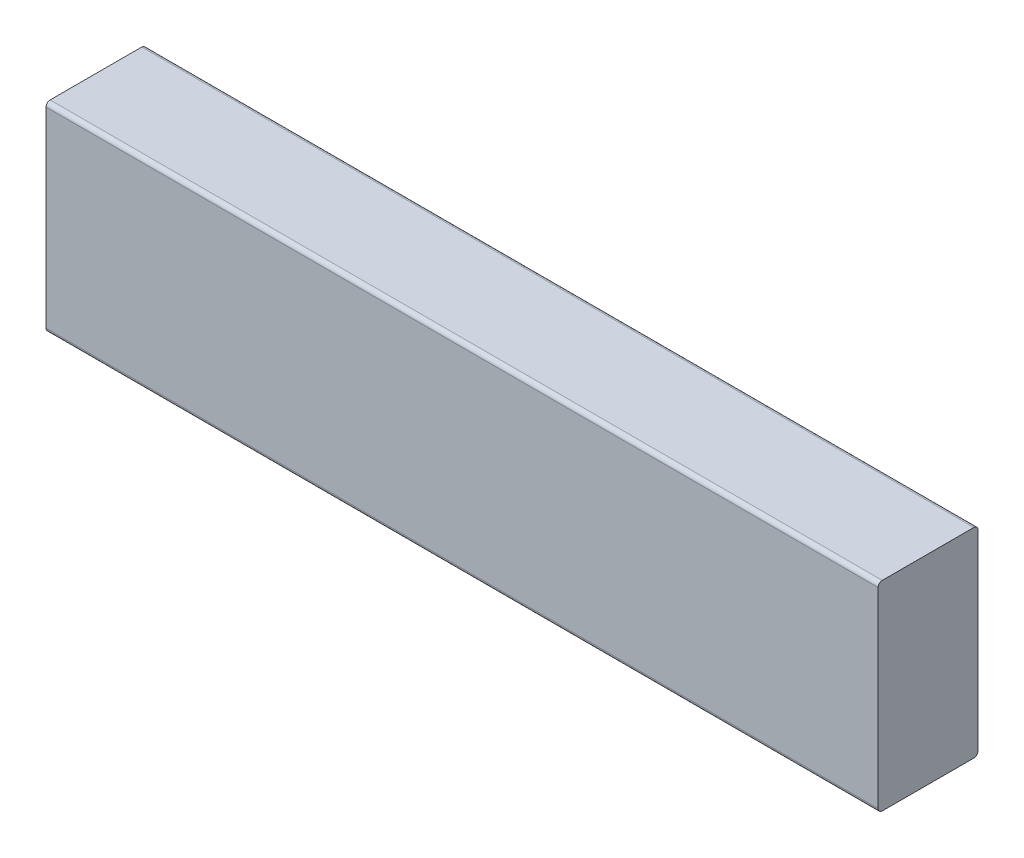
ISO-10303-21;
HEADER;
FILE_DESCRIPTION(('STEP AP214'),'2;1');
FILE_NAME('part.step','',(''),(''),'','','');
FILE_SCHEMA(('AUTOMOTIVE_DESIGN { 1 0 10303 214 1 1 1 1 }'));
ENDSEC;
DATA;
#1=APPLICATION_CONTEXT('core data for automotive mechanical design processes');
#2=APPLICATION_PROTOCOL_DEFINITION('international standard','automotive_design',2000,#1);
#3=PRODUCT_CONTEXT('',#1,'mechanical');
#4=PRODUCT('Part','Part','',(#3));
#5=PRODUCT_RELATED_PRODUCT_CATEGORY('part','',(#4));
#6=PRODUCT_DEFINITION_FORMATION('','',#4);
#7=PRODUCT_DEFINITION_CONTEXT('part definition',#1,'design');
#8=PRODUCT_DEFINITION('design','',#6,#7);
#9=PRODUCT_DEFINITION_SHAPE('','',#8);
#10=(LENGTH_UNIT() NAMED_UNIT(*) SI_UNIT(.MILLI.,.METRE.));
#11=(NAMED_UNIT(*) PLANE_ANGLE_UNIT() SI_UNIT($,.RADIAN.));
#12=(NAMED_UNIT(*) SI_UNIT($,.STERADIAN.) SOLID_ANGLE_UNIT());
#13=UNCERTAINTY_MEASURE_WITH_UNIT(LENGTH_MEASURE(1.E-05),#10,'distance_accuracy_value','');
#14=(GEOMETRIC_REPRESENTATION_CONTEXT(3) GLOBAL_UNCERTAINTY_ASSIGNED_CONTEXT((#13)) GLOBAL_UNIT_ASSIGNED_CONTEXT((#10,
#11,#12)) REPRESENTATION_CONTEXT('',''));
#15=CARTESIAN_POINT('',(0.,0.,0.));
#16=DIRECTION('',(0.,0.,1.));
#17=DIRECTION('',(1.,0.,0.));
#18=AXIS2_PLACEMENT_3D('',#15,#16,#17);
#19=CARTESIAN_POINT('',(0.,6.,6.));
#20=DIRECTION('',(0.,-1.,0.));
#21=DIRECTION('',(1.,0.,0.));
#22=AXIS2_PLACEMENT_3D('',#19,#20,#21);
#23=PLANE('',#22);
#24=DIRECTION('',(0.,0.,-1.));
#25=VECTOR('',#24,1.);
#26=CARTESIAN_POINT('',(6.,6.,6.));
#27=LINE('',#26,#25);
#28=CARTESIAN_POINT('',(6.,6.,5.75));
#29=VERTEX_POINT('',#28);
#30=CARTESIAN_POINT('',(6.,6.,0.25));
#31=VERTEX_POINT('',#30);
#32=EDGE_CURVE('E121',#29,#31,#27,.T.);
#33=ORIENTED_EDGE('',*,*,#32,.T.);
#34=DIRECTION('',(-1.,0.,0.));
#35=VECTOR('',#34,1.);
#36=CARTESIAN_POINT('',(-44.,5.99999999999999,0.25));
#37=LINE('',#36,#35);
#38=CARTESIAN_POINT('',(-44.,5.99999999999999,0.25));
#39=VERTEX_POINT('',#38);
#40=EDGE_CURVE('E11',#31,#39,#37,.T.);
#41=ORIENTED_EDGE('',*,*,#40,.T.);
#42=DIRECTION('',(0.,0.,-1.));
#43=VECTOR('',#42,1.);
#44=CARTESIAN_POINT('',(-44.,5.99999999999999,6.));
#45=LINE('',#44,#43);
#46=CARTESIAN_POINT('',(-44.,5.99999999999999,5.75));
#47=VERTEX_POINT('',#46);
#48=EDGE_CURVE('E126',#47,#39,#45,.T.);
#49=ORIENTED_EDGE('',*,*,#48,.F.);
#50=DIRECTION('',(-1.,0.,0.));
#51=VECTOR('',#50,1.);
#52=CARTESIAN_POINT('',(0.,6.,5.75));
#53=LINE('',#52,#51);
#54=EDGE_CURVE('E41',#47,#29,#53,.F.);
#55=ORIENTED_EDGE('',*,*,#54,.T.);
#56=EDGE_LOOP('',(#33,#41,#49,#55));
#57=FACE_BOUND('',#56,.T.);
#58=ADVANCED_FACE('F33',(#57),#23,.F.);
#59=CARTESIAN_POINT('',(-44.,5.99999999999999,6.));
#60=DIRECTION('',(1.,0.,0.));
#61=DIRECTION('',(0.,0.,-1.));
#62=AXIS2_PLACEMENT_3D('',#59,#60,#61);
#63=PLANE('',#62);
#64=DIRECTION('',(0.,-1.,0.));
#65=VECTOR('',#64,1.);
#66=CARTESIAN_POINT('',(-44.,5.99999999999999,0.));
#67=LINE('',#66,#65);
#68=CARTESIAN_POINT('',(-44.,5.74999999999999,0.));
#69=VERTEX_POINT('',#68);
#70=CARTESIAN_POINT('',(-44.,-5.75,0.));
#71=VERTEX_POINT('',#70);
#72=EDGE_CURVE('E120',#69,#71,#67,.T.);
#73=ORIENTED_EDGE('',*,*,#72,.T.);
#74=CARTESIAN_POINT('',(-44.,-5.75,0.25));
#75=DIRECTION('',(1.,0.,0.));
#76=DIRECTION('',(0.,0.,-1.));
#77=AXIS2_PLACEMENT_3D('',#74,#75,#76);
#78=CIRCLE('',#77,0.25);
#79=CARTESIAN_POINT('',(-44.,-6.,0.25));
#80=VERTEX_POINT('',#79);
#81=EDGE_CURVE('E144',#71,#80,#78,.F.);
#82=ORIENTED_EDGE('',*,*,#81,.T.);
#83=DIRECTION('',(0.,0.,-1.));
#84=VECTOR('',#83,1.);
#85=CARTESIAN_POINT('',(-44.,-6.,6.));
#86=LINE('',#85,#84);
#87=CARTESIAN_POINT('',(-44.,-6.,5.75));
#88=VERTEX_POINT('',#87);
#89=EDGE_CURVE('E130',#88,#80,#86,.T.);
#90=ORIENTED_EDGE('',*,*,#89,.F.);
#91=CARTESIAN_POINT('',(-44.,-5.75,5.75));
#92=DIRECTION('',(1.,0.,0.));
#93=DIRECTION('',(0.,0.,-1.));
#94=AXIS2_PLACEMENT_3D('',#91,#92,#93);
#95=CIRCLE('',#94,0.25);
#96=CARTESIAN_POINT('',(-44.,-5.75,6.));
#97=VERTEX_POINT('',#96);
#98=EDGE_CURVE('E125',#88,#97,#95,.F.);
#99=ORIENTED_EDGE('',*,*,#98,.T.);
#100=DIRECTION('',(0.,-1.,0.));
#101=VECTOR('',#100,1.);
#102=CARTESIAN_POINT('',(-44.,5.99999999999999,6.));
#103=LINE('',#102,#101);
#104=CARTESIAN_POINT('',(-44.,5.74999999999999,6.));
#105=VERTEX_POINT('',#104);
#106=EDGE_CURVE('E163',#105,#97,#103,.T.);
#107=ORIENTED_EDGE('',*,*,#106,.F.);
#108=CARTESIAN_POINT('',(-44.,5.74999999999999,5.75));
#109=DIRECTION('',(1.,0.,0.));
#110=DIRECTION('',(0.,0.,-1.));
#111=AXIS2_PLACEMENT_3D('',#108,#109,#110);
#112=CIRCLE('',#111,0.25);
#113=EDGE_CURVE('E55',#105,#47,#112,.F.);
#114=ORIENTED_EDGE('',*,*,#113,.T.);
#115=ORIENTED_EDGE('',*,*,#48,.T.);
#116=CARTESIAN_POINT('',(-44.,5.74999999999999,0.25));
#117=DIRECTION('',(1.,0.,0.));
#118=DIRECTION('',(0.,0.,-1.));
#119=AXIS2_PLACEMENT_3D('',#116,#117,#118);
#120=CIRCLE('',#119,0.25);
#121=EDGE_CURVE('E48',#39,#69,#120,.F.);
#122=ORIENTED_EDGE('',*,*,#121,.T.);
#123=EDGE_LOOP('',(#73,#82,#90,#99,#107,#114,#115,#122));
#124=FACE_BOUND('',#123,.T.);
#125=ADVANCED_FACE('F165',(#124),#63,.F.);
#126=CARTESIAN_POINT('',(-44.,-6.,6.));
#127=DIRECTION('',(0.,1.,0.));
#128=DIRECTION('',(0.,0.,1.));
#129=AXIS2_PLACEMENT_3D('',#126,#127,#128);
#130=PLANE('',#129);
#131=ORIENTED_EDGE('',*,*,#89,.T.);
#132=DIRECTION('',(1.,0.,0.));
#133=VECTOR('',#132,1.);
#134=CARTESIAN_POINT('',(6.,-6.,0.25));
#135=LINE('',#134,#133);
#136=CARTESIAN_POINT('',(6.,-6.,0.25));
#137=VERTEX_POINT('',#136);
#138=EDGE_CURVE('E119',#80,#137,#135,.T.);
#139=ORIENTED_EDGE('',*,*,#138,.T.);
#140=DIRECTION('',(0.,0.,-1.));
#141=VECTOR('',#140,1.);
#142=CARTESIAN_POINT('',(6.,-6.,6.));
#143=LINE('',#142,#141);
#144=CARTESIAN_POINT('',(6.,-6.,5.75));
#145=VERTEX_POINT('',#144);
#146=EDGE_CURVE('E102',#145,#137,#143,.T.);
#147=ORIENTED_EDGE('',*,*,#146,.F.);
#148=DIRECTION('',(1.,0.,0.));
#149=VECTOR('',#148,1.);
#150=CARTESIAN_POINT('',(-44.,-6.,5.75));
#151=LINE('',#150,#149);
#152=EDGE_CURVE('E116',#145,#88,#151,.F.);
#153=ORIENTED_EDGE('',*,*,#152,.T.);
#154=EDGE_LOOP('',(#131,#139,#147,#153));
#155=FACE_BOUND('',#154,.T.);
#156=ADVANCED_FACE('F115',(#155),#130,.F.);
#157=CARTESIAN_POINT('',(0.,0.,6.));
#158=DIRECTION('',(0.,0.,-1.));
#159=DIRECTION('',(-1.,0.,0.));
#160=AXIS2_PLACEMENT_3D('',#157,#158,#159);
#161=PLANE('',#160);
#162=ORIENTED_EDGE('',*,*,#106,.T.);
#163=DIRECTION('',(1.,0.,0.));
#164=VECTOR('',#163,1.);
#165=CARTESIAN_POINT('',(0.,-5.75,6.));
#166=LINE('',#165,#164);
#167=CARTESIAN_POINT('',(6.,-5.75,6.));
#168=VERTEX_POINT('',#167);
#169=EDGE_CURVE('E149',#97,#168,#166,.T.);
#170=ORIENTED_EDGE('',*,*,#169,.T.);
#171=DIRECTION('',(0.,1.,0.));
#172=VECTOR('',#171,1.);
#173=CARTESIAN_POINT('',(6.,6.,6.));
#174=LINE('',#173,#172);
#175=CARTESIAN_POINT('',(6.,5.75,6.));
#176=VERTEX_POINT('',#175);
#177=EDGE_CURVE('E104',#168,#176,#174,.T.);
#178=ORIENTED_EDGE('',*,*,#177,.T.);
#179=DIRECTION('',(-1.,0.,0.));
#180=VECTOR('',#179,1.);
#181=CARTESIAN_POINT('',(0.,5.75,6.));
#182=LINE('',#181,#180);
#183=EDGE_CURVE('E146',#176,#105,#182,.T.);
#184=ORIENTED_EDGE('',*,*,#183,.T.);
#185=EDGE_LOOP('',(#162,#170,#178,#184));
#186=FACE_BOUND('',#185,.T.);
#187=ADVANCED_FACE('F162',(#186),#161,.F.);
#188=CARTESIAN_POINT('',(0.,0.,0.));
#189=DIRECTION('',(0.,0.,-1.));
#190=DIRECTION('',(-1.,0.,0.));
#191=AXIS2_PLACEMENT_3D('',#188,#189,#190);
#192=PLANE('',#191);
#193=DIRECTION('',(0.,1.,0.));
#194=VECTOR('',#193,1.);
#195=CARTESIAN_POINT('',(6.,6.,0.));
#196=LINE('',#195,#194);
#197=CARTESIAN_POINT('',(6.,-5.75,0.));
#198=VERTEX_POINT('',#197);
#199=CARTESIAN_POINT('',(6.,5.75,0.));
#200=VERTEX_POINT('',#199);
#201=EDGE_CURVE('E169',#198,#200,#196,.T.);
#202=ORIENTED_EDGE('',*,*,#201,.F.);
#203=DIRECTION('',(1.,0.,0.));
#204=VECTOR('',#203,1.);
#205=CARTESIAN_POINT('',(-44.,-5.75,0.));
#206=LINE('',#205,#204);
#207=EDGE_CURVE('E139',#198,#71,#206,.F.);
#208=ORIENTED_EDGE('',*,*,#207,.T.);
#209=ORIENTED_EDGE('',*,*,#72,.F.);
#210=DIRECTION('',(-1.,0.,0.));
#211=VECTOR('',#210,1.);
#212=CARTESIAN_POINT('',(6.,5.75,0.));
#213=LINE('',#212,#211);
#214=EDGE_CURVE('E137',#69,#200,#213,.F.);
#215=ORIENTED_EDGE('',*,*,#214,.T.);
#216=EDGE_LOOP('',(#202,#208,#209,#215));
#217=FACE_BOUND('',#216,.T.);
#218=ADVANCED_FACE('F177',(#217),#192,.T.);
#219=CARTESIAN_POINT('',(6.,6.,6.));
#220=DIRECTION('',(-1.,0.,0.));
#221=DIRECTION('',(0.,0.,1.));
#222=AXIS2_PLACEMENT_3D('',#219,#220,#221);
#223=PLANE('',#222);
#224=ORIENTED_EDGE('',*,*,#146,.T.);
#225=CARTESIAN_POINT('',(6.,-5.75,0.25));
#226=DIRECTION('',(-1.,0.,0.));
#227=DIRECTION('',(0.,0.,1.));
#228=AXIS2_PLACEMENT_3D('',#225,#226,#227);
#229=CIRCLE('',#228,0.25);
#230=EDGE_CURVE('E109',#137,#198,#229,.F.);
#231=ORIENTED_EDGE('',*,*,#230,.T.);
#232=ORIENTED_EDGE('',*,*,#201,.T.);
#233=CARTESIAN_POINT('',(6.,5.75,0.25));
#234=DIRECTION('',(-1.,0.,0.));
#235=DIRECTION('',(0.,0.,1.));
#236=AXIS2_PLACEMENT_3D('',#233,#234,#235);
#237=CIRCLE('',#236,0.25);
#238=EDGE_CURVE('E110',#200,#31,#237,.F.);
#239=ORIENTED_EDGE('',*,*,#238,.T.);
#240=ORIENTED_EDGE('',*,*,#32,.F.);
#241=CARTESIAN_POINT('',(6.,5.75,5.75));
#242=DIRECTION('',(-1.,0.,0.));
#243=DIRECTION('',(0.,0.,1.));
#244=AXIS2_PLACEMENT_3D('',#241,#242,#243);
#245=CIRCLE('',#244,0.25);
#246=EDGE_CURVE('E128',#29,#176,#245,.F.);
#247=ORIENTED_EDGE('',*,*,#246,.T.);
#248=ORIENTED_EDGE('',*,*,#177,.F.);
#249=CARTESIAN_POINT('',(6.,-5.75,5.75));
#250=DIRECTION('',(-1.,0.,0.));
#251=DIRECTION('',(0.,0.,1.));
#252=AXIS2_PLACEMENT_3D('',#249,#250,#251);
#253=CIRCLE('',#252,0.25);
#254=EDGE_CURVE('E99',#168,#145,#253,.F.);
#255=ORIENTED_EDGE('',*,*,#254,.T.);
#256=EDGE_LOOP('',(#224,#231,#232,#239,#240,#247,#248,#255));
#257=FACE_BOUND('',#256,.T.);
#258=ADVANCED_FACE('F101',(#257),#223,.F.);
#259=CARTESIAN_POINT('',(-44.,-5.75,0.25));
#260=DIRECTION('',(-1.,0.,0.));
#261=DIRECTION('',(0.,0.,1.));
#262=AXIS2_PLACEMENT_3D('',#259,#260,#261);
#263=CYLINDRICAL_SURFACE('',#262,0.25);
#264=ORIENTED_EDGE('',*,*,#81,.F.);
#265=ORIENTED_EDGE('',*,*,#207,.F.);
#266=ORIENTED_EDGE('',*,*,#230,.F.);
#267=ORIENTED_EDGE('',*,*,#138,.F.);
#268=EDGE_LOOP('',(#264,#265,#266,#267));
#269=FACE_BOUND('',#268,.T.);
#270=ADVANCED_FACE('F179',(#269),#263,.T.);
#271=CARTESIAN_POINT('',(0.,-5.75,5.75));
#272=DIRECTION('',(1.,0.,0.));
#273=DIRECTION('',(0.,0.,-1.));
#274=AXIS2_PLACEMENT_3D('',#271,#272,#273);
#275=CYLINDRICAL_SURFACE('',#274,0.25);
#276=ORIENTED_EDGE('',*,*,#98,.F.);
#277=ORIENTED_EDGE('',*,*,#152,.F.);
#278=ORIENTED_EDGE('',*,*,#254,.F.);
#279=ORIENTED_EDGE('',*,*,#169,.F.);
#280=EDGE_LOOP('',(#276,#277,#278,#279));
#281=FACE_BOUND('',#280,.T.);
#282=ADVANCED_FACE('F124',(#281),#275,.T.);
#283=CARTESIAN_POINT('',(0.,5.75,0.25));
#284=DIRECTION('',(1.,0.,0.));
#285=DIRECTION('',(0.,1.,0.));
#286=AXIS2_PLACEMENT_3D('',#283,#284,#285);
#287=CYLINDRICAL_SURFACE('',#286,0.25);
#288=ORIENTED_EDGE('',*,*,#238,.F.);
#289=ORIENTED_EDGE('',*,*,#214,.F.);
#290=ORIENTED_EDGE('',*,*,#121,.F.);
#291=ORIENTED_EDGE('',*,*,#40,.F.);
#292=EDGE_LOOP('',(#288,#289,#290,#291));
#293=FACE_BOUND('',#292,.T.);
#294=ADVANCED_FACE('F174',(#293),#287,.T.);
#295=CARTESIAN_POINT('',(0.,5.75,5.75));
#296=DIRECTION('',(-1.,0.,0.));
#297=DIRECTION('',(0.,-1.,0.));
#298=AXIS2_PLACEMENT_3D('',#295,#296,#297);
#299=CYLINDRICAL_SURFACE('',#298,0.25);
#300=ORIENTED_EDGE('',*,*,#246,.F.);
#301=ORIENTED_EDGE('',*,*,#54,.F.);
#302=ORIENTED_EDGE('',*,*,#113,.F.);
#303=ORIENTED_EDGE('',*,*,#183,.F.);
#304=EDGE_LOOP('',(#300,#301,#302,#303));
#305=FACE_BOUND('',#304,.T.);
#306=ADVANCED_FACE('F35',(#305),#299,.T.);
#307=CLOSED_SHELL('',(#58,#125,#156,#187,#218,#258,#270,#282,#294,#306));
#308=MANIFOLD_SOLID_BREP('B2',#307);
#309=ADVANCED_BREP_SHAPE_REPRESENTATION('',(#18,#308),#14);
#310=SHAPE_DEFINITION_REPRESENTATION(#9,#309);
ENDSEC;
END-ISO-10303-21;
